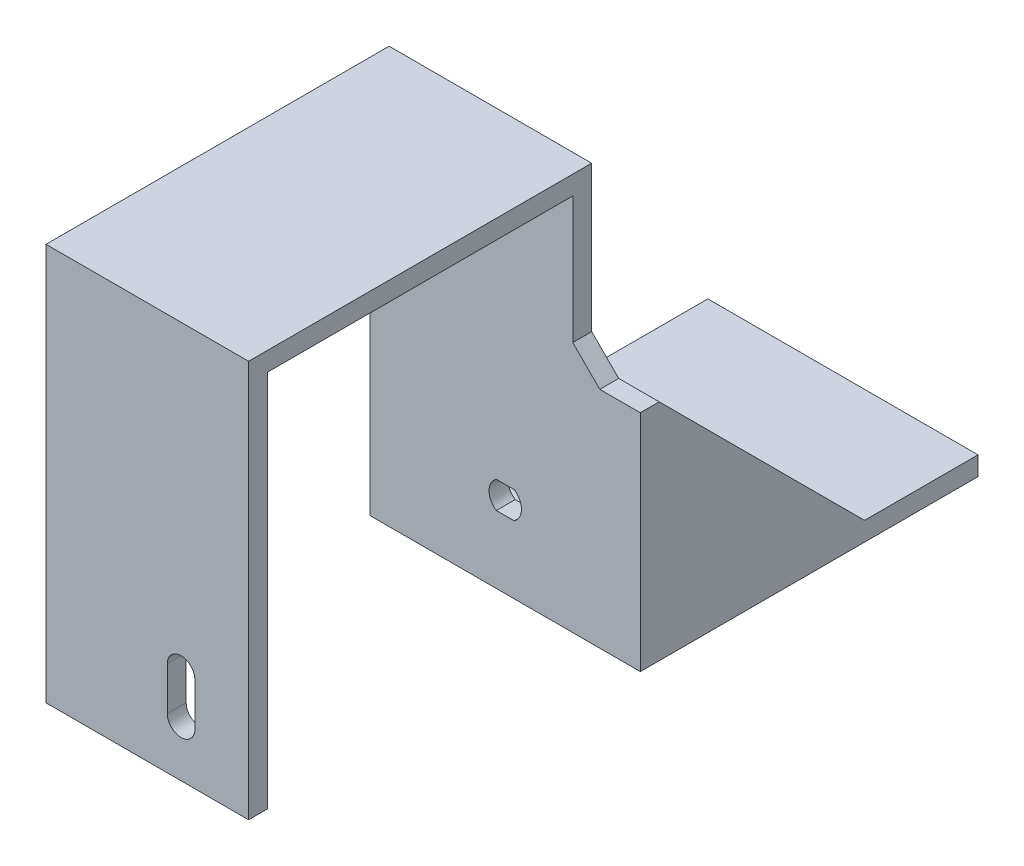
ISO-10303-21;
HEADER;
FILE_DESCRIPTION(('STEP AP214'),'2;1');
FILE_NAME('part.step','',(''),(''),'','','');
FILE_SCHEMA(('AUTOMOTIVE_DESIGN { 1 0 10303 214 1 1 1 1 }'));
ENDSEC;
DATA;
#1=APPLICATION_CONTEXT('core data for automotive mechanical design processes');
#2=APPLICATION_PROTOCOL_DEFINITION('international standard','automotive_design',2000,#1);
#3=PRODUCT_CONTEXT('',#1,'mechanical');
#4=PRODUCT('Part','Part','',(#3));
#5=PRODUCT_RELATED_PRODUCT_CATEGORY('part','',(#4));
#6=PRODUCT_DEFINITION_FORMATION('','',#4);
#7=PRODUCT_DEFINITION_CONTEXT('part definition',#1,'design');
#8=PRODUCT_DEFINITION('design','',#6,#7);
#9=PRODUCT_DEFINITION_SHAPE('','',#8);
#10=(LENGTH_UNIT() NAMED_UNIT(*) SI_UNIT(.MILLI.,.METRE.));
#11=(NAMED_UNIT(*) PLANE_ANGLE_UNIT() SI_UNIT($,.RADIAN.));
#12=(NAMED_UNIT(*) SI_UNIT($,.STERADIAN.) SOLID_ANGLE_UNIT());
#13=UNCERTAINTY_MEASURE_WITH_UNIT(LENGTH_MEASURE(1.E-05),#10,'distance_accuracy_value','');
#14=(GEOMETRIC_REPRESENTATION_CONTEXT(3) GLOBAL_UNCERTAINTY_ASSIGNED_CONTEXT((#13)) GLOBAL_UNIT_ASSIGNED_CONTEXT((#10,
#11,#12)) REPRESENTATION_CONTEXT('',''));
#15=CARTESIAN_POINT('',(0.,0.,0.));
#16=DIRECTION('',(0.,0.,1.));
#17=DIRECTION('',(1.,0.,0.));
#18=AXIS2_PLACEMENT_3D('',#15,#16,#17);
#19=CARTESIAN_POINT('',(46.3871311939213,7.,125.));
#20=DIRECTION('',(-1.,0.,0.));
#21=DIRECTION('',(0.,0.,1.));
#22=AXIS2_PLACEMENT_3D('',#19,#20,#21);
#23=PLANE('',#22);
#24=DIRECTION('',(0.,0.707106781186548,0.707106781186548));
#25=VECTOR('',#24,1.);
#26=CARTESIAN_POINT('',(46.3871311939213,90.,125.));
#27=LINE('',#26,#25);
#28=CARTESIAN_POINT('',(46.3871311939213,7.,42.));
#29=VERTEX_POINT('',#28);
#30=CARTESIAN_POINT('',(46.3871311939213,83.,118.));
#31=VERTEX_POINT('',#30);
#32=EDGE_CURVE('E266',#29,#31,#27,.T.);
#33=ORIENTED_EDGE('',*,*,#32,.T.);
#34=DIRECTION('',(0.,0.,-1.));
#35=VECTOR('',#34,1.);
#36=CARTESIAN_POINT('',(46.3871311939213,83.,245.));
#37=LINE('',#36,#35);
#38=CARTESIAN_POINT('',(46.3871311939213,83.,125.));
#39=VERTEX_POINT('',#38);
#40=EDGE_CURVE('E508',#39,#31,#37,.T.);
#41=ORIENTED_EDGE('',*,*,#40,.F.);
#42=DIRECTION('',(0.,1.,0.));
#43=VECTOR('',#42,1.);
#44=CARTESIAN_POINT('',(46.3871311939213,7.,125.));
#45=LINE('',#44,#43);
#46=CARTESIAN_POINT('',(46.3871311939213,0.,125.));
#47=VERTEX_POINT('',#46);
#48=EDGE_CURVE('E357',#47,#39,#45,.T.);
#49=ORIENTED_EDGE('',*,*,#48,.F.);
#50=DIRECTION('',(0.,0.,-1.));
#51=VECTOR('',#50,1.);
#52=CARTESIAN_POINT('',(46.3871311939213,0.,125.));
#53=LINE('',#52,#51);
#54=CARTESIAN_POINT('',(46.3871311939213,0.,0.));
#55=VERTEX_POINT('',#54);
#56=EDGE_CURVE('E381',#47,#55,#53,.T.);
#57=ORIENTED_EDGE('',*,*,#56,.T.);
#58=DIRECTION('',(0.,1.,0.));
#59=VECTOR('',#58,1.);
#60=CARTESIAN_POINT('',(46.3871311939213,7.,0.));
#61=LINE('',#60,#59);
#62=CARTESIAN_POINT('',(46.3871311939213,7.,0.));
#63=VERTEX_POINT('',#62);
#64=EDGE_CURVE('E369',#55,#63,#61,.T.);
#65=ORIENTED_EDGE('',*,*,#64,.T.);
#66=DIRECTION('',(0.,0.,-1.));
#67=VECTOR('',#66,1.);
#68=CARTESIAN_POINT('',(46.3871311939213,7.,125.));
#69=LINE('',#68,#67);
#70=EDGE_CURVE('E378',#29,#63,#69,.T.);
#71=ORIENTED_EDGE('',*,*,#70,.F.);
#72=EDGE_LOOP('',(#33,#41,#49,#57,#65,#71));
#73=FACE_BOUND('',#72,.T.);
#74=ADVANCED_FACE('F43',(#73),#23,.F.);
#75=CARTESIAN_POINT('',(-53.6128688060787,140.,245.));
#76=DIRECTION('',(0.,1.,0.));
#77=DIRECTION('',(0.,0.,1.));
#78=AXIS2_PLACEMENT_3D('',#75,#76,#77);
#79=PLANE('',#78);
#80=DIRECTION('',(1.,0.,0.));
#81=VECTOR('',#80,1.);
#82=CARTESIAN_POINT('',(-53.6128688060787,140.,125.));
#83=LINE('',#82,#81);
#84=CARTESIAN_POINT('',(-53.6128688060787,140.,125.));
#85=VERTEX_POINT('',#84);
#86=CARTESIAN_POINT('',(21.3871311939213,140.,125.));
#87=VERTEX_POINT('',#86);
#88=EDGE_CURVE('E252',#85,#87,#83,.T.);
#89=ORIENTED_EDGE('',*,*,#88,.T.);
#90=DIRECTION('',(0.,0.,1.));
#91=VECTOR('',#90,1.);
#92=CARTESIAN_POINT('',(21.3871311939213,140.,245.));
#93=LINE('',#92,#91);
#94=CARTESIAN_POINT('',(21.3871311939213,140.,238.));
#95=VERTEX_POINT('',#94);
#96=EDGE_CURVE('E481',#87,#95,#93,.T.);
#97=ORIENTED_EDGE('',*,*,#96,.T.);
#98=DIRECTION('',(1.,0.,0.));
#99=VECTOR('',#98,1.);
#100=CARTESIAN_POINT('',(-53.6128688060787,140.,238.));
#101=LINE('',#100,#99);
#102=CARTESIAN_POINT('',(-53.6128688060787,140.,238.));
#103=VERTEX_POINT('',#102);
#104=EDGE_CURVE('E214',#103,#95,#101,.T.);
#105=ORIENTED_EDGE('',*,*,#104,.F.);
#106=DIRECTION('',(0.,0.,-1.));
#107=VECTOR('',#106,1.);
#108=CARTESIAN_POINT('',(-53.6128688060787,140.,245.));
#109=LINE('',#108,#107);
#110=EDGE_CURVE('E260',#103,#85,#109,.T.);
#111=ORIENTED_EDGE('',*,*,#110,.T.);
#112=EDGE_LOOP('',(#89,#97,#105,#111));
#113=FACE_BOUND('',#112,.T.);
#114=ADVANCED_FACE('F439',(#113),#79,.F.);
#115=CARTESIAN_POINT('',(0.,0.,125.));
#116=DIRECTION('',(0.,0.,-1.));
#117=DIRECTION('',(-1.,0.,0.));
#118=AXIS2_PLACEMENT_3D('',#115,#116,#117);
#119=PLANE('',#118);
#120=CARTESIAN_POINT('',(-3.61286880607874,30.,125.));
#121=DIRECTION('',(0.,0.,1.));
#122=DIRECTION('',(1.,0.,0.));
#123=AXIS2_PLACEMENT_3D('',#120,#121,#122);
#124=CIRCLE('',#123,6.00000000000001);
#125=CARTESIAN_POINT('',(-6.92949359643414,35.,125.));
#126=VERTEX_POINT('',#125);
#127=CARTESIAN_POINT('',(-6.92949359643414,25.,125.));
#128=VERTEX_POINT('',#127);
#129=EDGE_CURVE('E309',#126,#128,#124,.T.);
#130=ORIENTED_EDGE('',*,*,#129,.F.);
#131=DIRECTION('',(-1.,0.,0.));
#132=VECTOR('',#131,1.);
#133=CARTESIAN_POINT('',(0.,35.,125.));
#134=LINE('',#133,#132);
#135=CARTESIAN_POINT('',(-0.296244015723339,35.,125.));
#136=VERTEX_POINT('',#135);
#137=EDGE_CURVE('E306',#136,#126,#134,.T.);
#138=ORIENTED_EDGE('',*,*,#137,.F.);
#139=CARTESIAN_POINT('',(-0.296244015723338,25.,125.));
#140=VERTEX_POINT('',#139);
#141=EDGE_CURVE('E314',#140,#136,#124,.T.);
#142=ORIENTED_EDGE('',*,*,#141,.F.);
#143=DIRECTION('',(1.,0.,0.));
#144=VECTOR('',#143,1.);
#145=CARTESIAN_POINT('',(0.,25.,125.));
#146=LINE('',#145,#144);
#147=EDGE_CURVE('E313',#128,#140,#146,.T.);
#148=ORIENTED_EDGE('',*,*,#147,.F.);
#149=EDGE_LOOP('',(#130,#138,#142,#148));
#150=FACE_BOUND('',#149,.T.);
#151=DIRECTION('',(-1.,0.,0.));
#152=VECTOR('',#151,1.);
#153=CARTESIAN_POINT('',(0.,83.,125.));
#154=LINE('',#153,#152);
#155=CARTESIAN_POINT('',(31.3871311939213,83.,125.));
#156=VERTEX_POINT('',#155);
#157=EDGE_CURVE('E513',#39,#156,#154,.T.);
#158=ORIENTED_EDGE('',*,*,#157,.T.);
#159=DIRECTION('',(0.707106781186544,-0.707106781186551,0.));
#160=VECTOR('',#159,1.);
#161=CARTESIAN_POINT('',(57.1935655969608,57.1935655969602,125.));
#162=LINE('',#161,#160);
#163=CARTESIAN_POINT('',(21.3871311939213,93.0000000000001,125.));
#164=VERTEX_POINT('',#163);
#165=EDGE_CURVE('E11',#156,#164,#162,.F.);
#166=ORIENTED_EDGE('',*,*,#165,.T.);
#167=DIRECTION('',(0.,1.,0.));
#168=VECTOR('',#167,1.);
#169=CARTESIAN_POINT('',(21.3871311939213,0.,125.));
#170=LINE('',#169,#168);
#171=EDGE_CURVE('E480',#164,#87,#170,.T.);
#172=ORIENTED_EDGE('',*,*,#171,.T.);
#173=ORIENTED_EDGE('',*,*,#88,.F.);
#174=DIRECTION('',(0.,-1.,0.));
#175=VECTOR('',#174,1.);
#176=CARTESIAN_POINT('',(-53.6128688060787,7.,125.));
#177=LINE('',#176,#175);
#178=CARTESIAN_POINT('',(-53.6128688060787,0.,125.));
#179=VERTEX_POINT('',#178);
#180=EDGE_CURVE('E350',#85,#179,#177,.T.);
#181=ORIENTED_EDGE('',*,*,#180,.T.);
#182=DIRECTION('',(1.,0.,0.));
#183=VECTOR('',#182,1.);
#184=CARTESIAN_POINT('',(46.3871311939213,0.,125.));
#185=LINE('',#184,#183);
#186=EDGE_CURVE('E353',#179,#47,#185,.T.);
#187=ORIENTED_EDGE('',*,*,#186,.T.);
#188=ORIENTED_EDGE('',*,*,#48,.T.);
#189=EDGE_LOOP('',(#158,#166,#172,#173,#181,#187,#188));
#190=FACE_BOUND('',#189,.T.);
#191=ADVANCED_FACE('F414',(#150,#190),#119,.F.);
#192=CARTESIAN_POINT('',(46.3871311939213,7.,125.));
#193=DIRECTION('',(0.,-1.,0.));
#194=DIRECTION('',(1.,0.,0.));
#195=AXIS2_PLACEMENT_3D('',#192,#193,#194);
#196=PLANE('',#195);
#197=DIRECTION('',(0.,0.,-1.));
#198=VECTOR('',#197,1.);
#199=CARTESIAN_POINT('',(39.3871311939213,7.,125.));
#200=LINE('',#199,#198);
#201=CARTESIAN_POINT('',(39.3871311939213,7.,118.));
#202=VERTEX_POINT('',#201);
#203=CARTESIAN_POINT('',(39.3871311939213,7.,42.));
#204=VERTEX_POINT('',#203);
#205=EDGE_CURVE('E271',#202,#204,#200,.T.);
#206=ORIENTED_EDGE('',*,*,#205,.T.);
#207=DIRECTION('',(1.,0.,0.));
#208=VECTOR('',#207,1.);
#209=CARTESIAN_POINT('',(46.3871311939213,7.,42.));
#210=LINE('',#209,#208);
#211=EDGE_CURVE('E277',#204,#29,#210,.T.);
#212=ORIENTED_EDGE('',*,*,#211,.T.);
#213=ORIENTED_EDGE('',*,*,#70,.T.);
#214=DIRECTION('',(-1.,0.,0.));
#215=VECTOR('',#214,1.);
#216=CARTESIAN_POINT('',(46.3871311939213,7.,0.));
#217=LINE('',#216,#215);
#218=CARTESIAN_POINT('',(-53.6128688060787,7.,0.));
#219=VERTEX_POINT('',#218);
#220=EDGE_CURVE('E354',#63,#219,#217,.T.);
#221=ORIENTED_EDGE('',*,*,#220,.T.);
#222=DIRECTION('',(0.,0.,-1.));
#223=VECTOR('',#222,1.);
#224=CARTESIAN_POINT('',(-53.6128688060787,7.,125.));
#225=LINE('',#224,#223);
#226=CARTESIAN_POINT('',(-53.6128688060787,6.99999999999999,42.));
#227=VERTEX_POINT('',#226);
#228=EDGE_CURVE('E361',#227,#219,#225,.T.);
#229=ORIENTED_EDGE('',*,*,#228,.F.);
#230=DIRECTION('',(1.,0.,0.));
#231=VECTOR('',#230,1.);
#232=CARTESIAN_POINT('',(46.3871311939213,7.,42.));
#233=LINE('',#232,#231);
#234=CARTESIAN_POINT('',(-46.6128688060787,7.,42.));
#235=VERTEX_POINT('',#234);
#236=EDGE_CURVE('E291',#227,#235,#233,.T.);
#237=ORIENTED_EDGE('',*,*,#236,.T.);
#238=DIRECTION('',(0.,0.,-1.));
#239=VECTOR('',#238,1.);
#240=CARTESIAN_POINT('',(-46.6128688060787,7.,125.));
#241=LINE('',#240,#239);
#242=CARTESIAN_POINT('',(-46.6128688060787,7.00000000000001,118.));
#243=VERTEX_POINT('',#242);
#244=EDGE_CURVE('E285',#243,#235,#241,.T.);
#245=ORIENTED_EDGE('',*,*,#244,.F.);
#246=DIRECTION('',(-1.,0.,0.));
#247=VECTOR('',#246,1.);
#248=CARTESIAN_POINT('',(46.3871311939213,7.,118.));
#249=LINE('',#248,#247);
#250=EDGE_CURVE('E335',#202,#243,#249,.T.);
#251=ORIENTED_EDGE('',*,*,#250,.F.);
#252=EDGE_LOOP('',(#206,#212,#213,#221,#229,#237,#245,#251));
#253=FACE_BOUND('',#252,.T.);
#254=ADVANCED_FACE('F449',(#253),#196,.F.);
#255=CARTESIAN_POINT('',(-53.6128688060787,7.,125.));
#256=DIRECTION('',(1.,0.,0.));
#257=DIRECTION('',(0.,0.,-1.));
#258=AXIS2_PLACEMENT_3D('',#255,#256,#257);
#259=PLANE('',#258);
#260=DIRECTION('',(0.,-0.707106781186548,-0.707106781186548));
#261=VECTOR('',#260,1.);
#262=CARTESIAN_POINT('',(-53.6128688060787,90.,125.));
#263=LINE('',#262,#261);
#264=CARTESIAN_POINT('',(-53.6128688060787,83.,118.));
#265=VERTEX_POINT('',#264);
#266=EDGE_CURVE('E280',#265,#227,#263,.T.);
#267=ORIENTED_EDGE('',*,*,#266,.T.);
#268=ORIENTED_EDGE('',*,*,#228,.T.);
#269=DIRECTION('',(0.,-1.,0.));
#270=VECTOR('',#269,1.);
#271=CARTESIAN_POINT('',(-53.6128688060787,7.,0.));
#272=LINE('',#271,#270);
#273=CARTESIAN_POINT('',(-53.6128688060787,0.,0.));
#274=VERTEX_POINT('',#273);
#275=EDGE_CURVE('E349',#219,#274,#272,.T.);
#276=ORIENTED_EDGE('',*,*,#275,.T.);
#277=DIRECTION('',(0.,0.,-1.));
#278=VECTOR('',#277,1.);
#279=CARTESIAN_POINT('',(-53.6128688060787,0.,125.));
#280=LINE('',#279,#278);
#281=EDGE_CURVE('E384',#179,#274,#280,.T.);
#282=ORIENTED_EDGE('',*,*,#281,.F.);
#283=ORIENTED_EDGE('',*,*,#180,.F.);
#284=ORIENTED_EDGE('',*,*,#110,.F.);
#285=DIRECTION('',(0.,1.,0.));
#286=VECTOR('',#285,1.);
#287=CARTESIAN_POINT('',(-53.6128688060787,0.,238.));
#288=LINE('',#287,#286);
#289=CARTESIAN_POINT('',(-53.6128688060787,0.,238.));
#290=VERTEX_POINT('',#289);
#291=EDGE_CURVE('E242',#290,#103,#288,.T.);
#292=ORIENTED_EDGE('',*,*,#291,.F.);
#293=DIRECTION('',(0.,0.,-1.));
#294=VECTOR('',#293,1.);
#295=CARTESIAN_POINT('',(-53.6128688060787,0.,245.));
#296=LINE('',#295,#294);
#297=CARTESIAN_POINT('',(-53.6128688060787,0.,245.));
#298=VERTEX_POINT('',#297);
#299=EDGE_CURVE('E235',#298,#290,#296,.T.);
#300=ORIENTED_EDGE('',*,*,#299,.F.);
#301=DIRECTION('',(0.,-1.,0.));
#302=VECTOR('',#301,1.);
#303=CARTESIAN_POINT('',(-53.6128688060787,147.,245.));
#304=LINE('',#303,#302);
#305=CARTESIAN_POINT('',(-53.6128688060787,147.,245.));
#306=VERTEX_POINT('',#305);
#307=EDGE_CURVE('E253',#306,#298,#304,.T.);
#308=ORIENTED_EDGE('',*,*,#307,.F.);
#309=DIRECTION('',(0.,0.,1.));
#310=VECTOR('',#309,1.);
#311=CARTESIAN_POINT('',(-53.6128688060787,147.,125.));
#312=LINE('',#311,#310);
#313=CARTESIAN_POINT('',(-53.6128688060787,147.,118.));
#314=VERTEX_POINT('',#313);
#315=EDGE_CURVE('E339',#314,#306,#312,.T.);
#316=ORIENTED_EDGE('',*,*,#315,.F.);
#317=DIRECTION('',(0.,-1.,0.));
#318=VECTOR('',#317,1.);
#319=CARTESIAN_POINT('',(-53.6128688060787,147.,118.));
#320=LINE('',#319,#318);
#321=EDGE_CURVE('E343',#314,#265,#320,.T.);
#322=ORIENTED_EDGE('',*,*,#321,.T.);
#323=EDGE_LOOP('',(#267,#268,#276,#282,#283,#284,#292,#300,#308,#316,#322));
#324=FACE_BOUND('',#323,.T.);
#325=ADVANCED_FACE('F454',(#324),#259,.F.);
#326=CARTESIAN_POINT('',(46.3871311939213,0.,125.));
#327=DIRECTION('',(0.,1.,0.));
#328=DIRECTION('',(-1.,0.,0.));
#329=AXIS2_PLACEMENT_3D('',#326,#327,#328);
#330=PLANE('',#329);
#331=DIRECTION('',(1.,0.,0.));
#332=VECTOR('',#331,1.);
#333=CARTESIAN_POINT('',(46.3871311939213,0.,0.));
#334=LINE('',#333,#332);
#335=EDGE_CURVE('E365',#274,#55,#334,.T.);
#336=ORIENTED_EDGE('',*,*,#335,.T.);
#337=ORIENTED_EDGE('',*,*,#56,.F.);
#338=ORIENTED_EDGE('',*,*,#186,.F.);
#339=ORIENTED_EDGE('',*,*,#281,.T.);
#340=EDGE_LOOP('',(#336,#337,#338,#339));
#341=FACE_BOUND('',#340,.T.);
#342=ADVANCED_FACE('F451',(#341),#330,.F.);
#343=CARTESIAN_POINT('',(0.,0.,0.));
#344=DIRECTION('',(0.,0.,-1.));
#345=DIRECTION('',(-1.,0.,0.));
#346=AXIS2_PLACEMENT_3D('',#343,#344,#345);
#347=PLANE('',#346);
#348=ORIENTED_EDGE('',*,*,#275,.F.);
#349=ORIENTED_EDGE('',*,*,#220,.F.);
#350=ORIENTED_EDGE('',*,*,#64,.F.);
#351=ORIENTED_EDGE('',*,*,#335,.F.);
#352=EDGE_LOOP('',(#348,#349,#350,#351));
#353=FACE_BOUND('',#352,.T.);
#354=ADVANCED_FACE('F453',(#353),#347,.T.);
#355=CARTESIAN_POINT('',(46.3871311939213,147.,118.));
#356=DIRECTION('',(0.,0.,1.));
#357=DIRECTION('',(1.,0.,0.));
#358=AXIS2_PLACEMENT_3D('',#355,#356,#357);
#359=PLANE('',#358);
#360=CARTESIAN_POINT('',(-3.61286880607874,30.,118.));
#361=DIRECTION('',(0.,0.,1.));
#362=DIRECTION('',(1.,0.,0.));
#363=AXIS2_PLACEMENT_3D('',#360,#361,#362);
#364=CIRCLE('',#363,6.00000000000001);
#365=CARTESIAN_POINT('',(-0.296244015723339,35.,118.));
#366=VERTEX_POINT('',#365);
#367=CARTESIAN_POINT('',(-0.296244015723338,25.,118.));
#368=VERTEX_POINT('',#367);
#369=EDGE_CURVE('E298',#366,#368,#364,.F.);
#370=ORIENTED_EDGE('',*,*,#369,.F.);
#371=DIRECTION('',(1.,0.,0.));
#372=VECTOR('',#371,1.);
#373=CARTESIAN_POINT('',(0.,35.,118.));
#374=LINE('',#373,#372);
#375=CARTESIAN_POINT('',(-6.92949359643414,35.,118.));
#376=VERTEX_POINT('',#375);
#377=EDGE_CURVE('E302',#376,#366,#374,.T.);
#378=ORIENTED_EDGE('',*,*,#377,.F.);
#379=CARTESIAN_POINT('',(-3.61286880607874,30.,118.));
#380=DIRECTION('',(0.,0.,1.));
#381=DIRECTION('',(1.,0.,0.));
#382=AXIS2_PLACEMENT_3D('',#379,#380,#381);
#383=CIRCLE('',#382,6.00000000000001);
#384=CARTESIAN_POINT('',(-6.92949359643415,25.,118.));
#385=VERTEX_POINT('',#384);
#386=EDGE_CURVE('E321',#385,#376,#383,.F.);
#387=ORIENTED_EDGE('',*,*,#386,.F.);
#388=DIRECTION('',(-1.,0.,0.));
#389=VECTOR('',#388,1.);
#390=CARTESIAN_POINT('',(0.,25.,118.));
#391=LINE('',#390,#389);
#392=EDGE_CURVE('E295',#368,#385,#391,.T.);
#393=ORIENTED_EDGE('',*,*,#392,.F.);
#394=EDGE_LOOP('',(#370,#378,#387,#393));
#395=FACE_BOUND('',#394,.T.);
#396=DIRECTION('',(-1.,0.,0.));
#397=VECTOR('',#396,1.);
#398=CARTESIAN_POINT('',(46.3871311939213,147.,118.));
#399=LINE('',#398,#397);
#400=CARTESIAN_POINT('',(21.3871311939213,147.,118.));
#401=VERTEX_POINT('',#400);
#402=EDGE_CURVE('E336',#401,#314,#399,.T.);
#403=ORIENTED_EDGE('',*,*,#402,.F.);
#404=DIRECTION('',(0.,1.,0.));
#405=VECTOR('',#404,1.);
#406=CARTESIAN_POINT('',(21.3871311939213,83.,118.));
#407=LINE('',#406,#405);
#408=CARTESIAN_POINT('',(21.3871311939213,93.0000000000001,118.));
#409=VERTEX_POINT('',#408);
#410=EDGE_CURVE('E515',#409,#401,#407,.T.);
#411=ORIENTED_EDGE('',*,*,#410,.F.);
#412=DIRECTION('',(-0.707106781186544,0.707106781186551,0.));
#413=VECTOR('',#412,1.);
#414=CARTESIAN_POINT('',(6.88713119392116,107.5,118.));
#415=LINE('',#414,#413);
#416=CARTESIAN_POINT('',(31.3871311939213,83.,118.));
#417=VERTEX_POINT('',#416);
#418=EDGE_CURVE('E53',#409,#417,#415,.F.);
#419=ORIENTED_EDGE('',*,*,#418,.T.);
#420=DIRECTION('',(-1.,0.,0.));
#421=VECTOR('',#420,1.);
#422=CARTESIAN_POINT('',(46.3871311939213,83.,118.));
#423=LINE('',#422,#421);
#424=CARTESIAN_POINT('',(39.3871311939213,83.,118.));
#425=VERTEX_POINT('',#424);
#426=EDGE_CURVE('E231',#425,#417,#423,.T.);
#427=ORIENTED_EDGE('',*,*,#426,.F.);
#428=DIRECTION('',(0.,-1.,0.));
#429=VECTOR('',#428,1.);
#430=CARTESIAN_POINT('',(39.3871311939213,147.,118.));
#431=LINE('',#430,#429);
#432=EDGE_CURVE('E395',#425,#202,#431,.T.);
#433=ORIENTED_EDGE('',*,*,#432,.T.);
#434=ORIENTED_EDGE('',*,*,#250,.T.);
#435=DIRECTION('',(0.,-1.,0.));
#436=VECTOR('',#435,1.);
#437=CARTESIAN_POINT('',(-46.6128688060787,147.,118.));
#438=LINE('',#437,#436);
#439=CARTESIAN_POINT('',(-46.6128688060787,83.,118.));
#440=VERTEX_POINT('',#439);
#441=EDGE_CURVE('E387',#440,#243,#438,.T.);
#442=ORIENTED_EDGE('',*,*,#441,.F.);
#443=DIRECTION('',(-1.,0.,0.));
#444=VECTOR('',#443,1.);
#445=CARTESIAN_POINT('',(46.3871311939213,83.,118.));
#446=LINE('',#445,#444);
#447=EDGE_CURVE('E391',#440,#265,#446,.T.);
#448=ORIENTED_EDGE('',*,*,#447,.T.);
#449=ORIENTED_EDGE('',*,*,#321,.F.);
#450=EDGE_LOOP('',(#403,#411,#419,#427,#433,#434,#442,#448,#449));
#451=FACE_BOUND('',#450,.T.);
#452=ADVANCED_FACE('F426',(#395,#451),#359,.F.);
#453=CARTESIAN_POINT('',(0.,147.,0.));
#454=DIRECTION('',(0.,1.,0.));
#455=DIRECTION('',(-1.,0.,0.));
#456=AXIS2_PLACEMENT_3D('',#453,#454,#455);
#457=PLANE('',#456);
#458=DIRECTION('',(0.,0.,-1.));
#459=VECTOR('',#458,1.);
#460=CARTESIAN_POINT('',(21.3871311939213,147.,245.));
#461=LINE('',#460,#459);
#462=CARTESIAN_POINT('',(21.3871311939213,147.,245.));
#463=VERTEX_POINT('',#462);
#464=EDGE_CURVE('E491',#463,#401,#461,.T.);
#465=ORIENTED_EDGE('',*,*,#464,.T.);
#466=ORIENTED_EDGE('',*,*,#402,.T.);
#467=ORIENTED_EDGE('',*,*,#315,.T.);
#468=DIRECTION('',(-1.,0.,0.));
#469=VECTOR('',#468,1.);
#470=CARTESIAN_POINT('',(-53.6128688060787,147.,245.));
#471=LINE('',#470,#469);
#472=EDGE_CURVE('E257',#463,#306,#471,.T.);
#473=ORIENTED_EDGE('',*,*,#472,.F.);
#474=EDGE_LOOP('',(#465,#466,#467,#473));
#475=FACE_BOUND('',#474,.T.);
#476=ADVANCED_FACE('F489',(#475),#457,.T.);
#477=CARTESIAN_POINT('',(0.,35.,-0.001000000000001));
#478=DIRECTION('',(0.,1.,0.));
#479=DIRECTION('',(0.,0.,1.));
#480=AXIS2_PLACEMENT_3D('',#477,#478,#479);
#481=PLANE('',#480);
#482=ORIENTED_EDGE('',*,*,#377,.T.);
#483=DIRECTION('',(0.,0.,1.));
#484=VECTOR('',#483,1.);
#485=CARTESIAN_POINT('',(-0.296244015723339,35.,-0.001000000000001));
#486=LINE('',#485,#484);
#487=EDGE_CURVE('E318',#366,#136,#486,.T.);
#488=ORIENTED_EDGE('',*,*,#487,.T.);
#489=ORIENTED_EDGE('',*,*,#137,.T.);
#490=DIRECTION('',(0.,0.,1.));
#491=VECTOR('',#490,1.);
#492=CARTESIAN_POINT('',(-6.92949359643413,35.,-0.001000000000001));
#493=LINE('',#492,#491);
#494=EDGE_CURVE('E328',#376,#126,#493,.T.);
#495=ORIENTED_EDGE('',*,*,#494,.F.);
#496=EDGE_LOOP('',(#482,#488,#489,#495));
#497=FACE_BOUND('',#496,.T.);
#498=ADVANCED_FACE('F417',(#497),#481,.F.);
#499=CARTESIAN_POINT('',(-3.61286880607874,30.,-0.001000000000001));
#500=DIRECTION('',(0.,0.,1.));
#501=DIRECTION('',(1.,0.,0.));
#502=AXIS2_PLACEMENT_3D('',#499,#500,#501);
#503=CYLINDRICAL_SURFACE('',#502,6.00000000000001);
#504=ORIENTED_EDGE('',*,*,#369,.T.);
#505=DIRECTION('',(0.,0.,1.));
#506=VECTOR('',#505,1.);
#507=CARTESIAN_POINT('',(-0.296244015723338,25.,-0.001000000000001));
#508=LINE('',#507,#506);
#509=EDGE_CURVE('E322',#368,#140,#508,.T.);
#510=ORIENTED_EDGE('',*,*,#509,.T.);
#511=ORIENTED_EDGE('',*,*,#141,.T.);
#512=ORIENTED_EDGE('',*,*,#487,.F.);
#513=EDGE_LOOP('',(#504,#510,#511,#512));
#514=FACE_BOUND('',#513,.T.);
#515=ADVANCED_FACE('F410',(#514),#503,.F.);
#516=CARTESIAN_POINT('',(0.,25.,-0.001000000000001));
#517=DIRECTION('',(0.,-1.,0.));
#518=DIRECTION('',(0.,0.,-1.));
#519=AXIS2_PLACEMENT_3D('',#516,#517,#518);
#520=PLANE('',#519);
#521=ORIENTED_EDGE('',*,*,#392,.T.);
#522=DIRECTION('',(0.,0.,1.));
#523=VECTOR('',#522,1.);
#524=CARTESIAN_POINT('',(-6.92949359643414,25.,-0.001000000000001));
#525=LINE('',#524,#523);
#526=EDGE_CURVE('E325',#385,#128,#525,.T.);
#527=ORIENTED_EDGE('',*,*,#526,.T.);
#528=ORIENTED_EDGE('',*,*,#147,.T.);
#529=ORIENTED_EDGE('',*,*,#509,.F.);
#530=EDGE_LOOP('',(#521,#527,#528,#529));
#531=FACE_BOUND('',#530,.T.);
#532=ADVANCED_FACE('F428',(#531),#520,.F.);
#533=ORIENTED_EDGE('',*,*,#386,.T.);
#534=ORIENTED_EDGE('',*,*,#494,.T.);
#535=ORIENTED_EDGE('',*,*,#129,.T.);
#536=ORIENTED_EDGE('',*,*,#526,.F.);
#537=EDGE_LOOP('',(#533,#534,#535,#536));
#538=FACE_BOUND('',#537,.T.);
#539=ADVANCED_FACE('F419',(#538),#503,.F.);
#540=CARTESIAN_POINT('',(-46.6128688060787,90.,125.));
#541=DIRECTION('',(0.,0.707106781186547,-0.707106781186547));
#542=DIRECTION('',(0.,0.707106781186548,0.707106781186548));
#543=AXIS2_PLACEMENT_3D('',#540,#541,#542);
#544=PLANE('',#543);
#545=ORIENTED_EDGE('',*,*,#236,.F.);
#546=ORIENTED_EDGE('',*,*,#266,.F.);
#547=ORIENTED_EDGE('',*,*,#447,.F.);
#548=DIRECTION('',(0.,-0.707106781186548,-0.707106781186548));
#549=VECTOR('',#548,1.);
#550=CARTESIAN_POINT('',(-46.6128688060787,90.,125.));
#551=LINE('',#550,#549);
#552=EDGE_CURVE('E281',#440,#235,#551,.T.);
#553=ORIENTED_EDGE('',*,*,#552,.T.);
#554=EDGE_LOOP('',(#545,#546,#547,#553));
#555=FACE_BOUND('',#554,.T.);
#556=ADVANCED_FACE('F435',(#555),#544,.T.);
#557=CARTESIAN_POINT('',(-46.6128688060787,0.,0.));
#558=DIRECTION('',(-1.,0.,0.));
#559=DIRECTION('',(0.,0.,1.));
#560=AXIS2_PLACEMENT_3D('',#557,#558,#559);
#561=PLANE('',#560);
#562=ORIENTED_EDGE('',*,*,#441,.T.);
#563=ORIENTED_EDGE('',*,*,#244,.T.);
#564=ORIENTED_EDGE('',*,*,#552,.F.);
#565=EDGE_LOOP('',(#562,#563,#564));
#566=FACE_BOUND('',#565,.T.);
#567=ADVANCED_FACE('F495',(#566),#561,.F.);
#568=CARTESIAN_POINT('',(39.3871311939213,90.,125.));
#569=DIRECTION('',(0.,0.707106781186547,-0.707106781186547));
#570=DIRECTION('',(0.,0.707106781186548,0.707106781186548));
#571=AXIS2_PLACEMENT_3D('',#568,#569,#570);
#572=PLANE('',#571);
#573=ORIENTED_EDGE('',*,*,#211,.F.);
#574=DIRECTION('',(0.,0.707106781186548,0.707106781186548));
#575=VECTOR('',#574,1.);
#576=CARTESIAN_POINT('',(39.3871311939213,90.,125.));
#577=LINE('',#576,#575);
#578=EDGE_CURVE('E267',#204,#425,#577,.T.);
#579=ORIENTED_EDGE('',*,*,#578,.T.);
#580=DIRECTION('',(-1.,0.,0.));
#581=VECTOR('',#580,1.);
#582=CARTESIAN_POINT('',(46.3871311939213,83.,118.));
#583=LINE('',#582,#581);
#584=EDGE_CURVE('E220',#31,#425,#583,.T.);
#585=ORIENTED_EDGE('',*,*,#584,.F.);
#586=ORIENTED_EDGE('',*,*,#32,.F.);
#587=EDGE_LOOP('',(#573,#579,#585,#586));
#588=FACE_BOUND('',#587,.T.);
#589=ADVANCED_FACE('F505',(#588),#572,.T.);
#590=CARTESIAN_POINT('',(39.3871311939213,0.,0.));
#591=DIRECTION('',(-1.,0.,0.));
#592=DIRECTION('',(0.,0.,1.));
#593=AXIS2_PLACEMENT_3D('',#590,#591,#592);
#594=PLANE('',#593);
#595=ORIENTED_EDGE('',*,*,#205,.F.);
#596=ORIENTED_EDGE('',*,*,#432,.F.);
#597=ORIENTED_EDGE('',*,*,#578,.F.);
#598=EDGE_LOOP('',(#595,#596,#597));
#599=FACE_BOUND('',#598,.T.);
#600=ADVANCED_FACE('F502',(#599),#594,.T.);
#601=CARTESIAN_POINT('',(0.,0.,245.));
#602=DIRECTION('',(0.,0.,1.));
#603=DIRECTION('',(1.,0.,0.));
#604=AXIS2_PLACEMENT_3D('',#601,#602,#603);
#605=PLANE('',#604);
#606=DIRECTION('',(-1.,0.,0.));
#607=VECTOR('',#606,1.);
#608=CARTESIAN_POINT('',(-53.6128688060787,0.,245.));
#609=LINE('',#608,#607);
#610=CARTESIAN_POINT('',(21.3871311939213,0.,245.));
#611=VERTEX_POINT('',#610);
#612=EDGE_CURVE('E238',#611,#298,#609,.T.);
#613=ORIENTED_EDGE('',*,*,#612,.F.);
#614=DIRECTION('',(0.,1.,0.));
#615=VECTOR('',#614,1.);
#616=CARTESIAN_POINT('',(21.3871311939213,83.,245.));
#617=LINE('',#616,#615);
#618=EDGE_CURVE('E227',#611,#463,#617,.T.);
#619=ORIENTED_EDGE('',*,*,#618,.T.);
#620=ORIENTED_EDGE('',*,*,#472,.T.);
#621=ORIENTED_EDGE('',*,*,#307,.T.);
#622=EDGE_LOOP('',(#613,#619,#620,#621));
#623=FACE_BOUND('',#622,.T.);
#624=CARTESIAN_POINT('',(-3.61286880607872,35.,245.));
#625=DIRECTION('',(0.,0.,1.));
#626=DIRECTION('',(-1.,0.,0.));
#627=AXIS2_PLACEMENT_3D('',#624,#625,#626);
#628=CIRCLE('',#627,5.10355991505071);
#629=CARTESIAN_POINT('',(1.49069110897199,35.,245.));
#630=VERTEX_POINT('',#629);
#631=CARTESIAN_POINT('',(-8.71642872112944,35.,245.));
#632=VERTEX_POINT('',#631);
#633=EDGE_CURVE('E535',#630,#632,#628,.T.);
#634=ORIENTED_EDGE('',*,*,#633,.F.);
#635=DIRECTION('',(0.,1.,0.));
#636=VECTOR('',#635,1.);
#637=CARTESIAN_POINT('',(1.49069110897199,35.,245.));
#638=LINE('',#637,#636);
#639=CARTESIAN_POINT('',(1.49069110897199,19.,245.));
#640=VERTEX_POINT('',#639);
#641=EDGE_CURVE('E531',#640,#630,#638,.T.);
#642=ORIENTED_EDGE('',*,*,#641,.F.);
#643=CARTESIAN_POINT('',(-3.61286880607872,19.,245.));
#644=DIRECTION('',(0.,0.,1.));
#645=DIRECTION('',(1.,0.,0.));
#646=AXIS2_PLACEMENT_3D('',#643,#644,#645);
#647=CIRCLE('',#646,5.10355991505071);
#648=CARTESIAN_POINT('',(-8.71642872112943,19.,245.));
#649=VERTEX_POINT('',#648);
#650=EDGE_CURVE('E543',#649,#640,#647,.T.);
#651=ORIENTED_EDGE('',*,*,#650,.F.);
#652=DIRECTION('',(0.,-1.,0.));
#653=VECTOR('',#652,1.);
#654=CARTESIAN_POINT('',(-8.71642872112944,35.,245.));
#655=LINE('',#654,#653);
#656=EDGE_CURVE('E547',#632,#649,#655,.T.);
#657=ORIENTED_EDGE('',*,*,#656,.F.);
#658=EDGE_LOOP('',(#634,#642,#651,#657));
#659=FACE_BOUND('',#658,.T.);
#660=ADVANCED_FACE('F484',(#623,#659),#605,.T.);
#661=CARTESIAN_POINT('',(-53.6128688060787,0.,238.));
#662=DIRECTION('',(0.,0.,1.));
#663=DIRECTION('',(1.,0.,0.));
#664=AXIS2_PLACEMENT_3D('',#661,#662,#663);
#665=PLANE('',#664);
#666=DIRECTION('',(0.,-1.,0.));
#667=VECTOR('',#666,1.);
#668=CARTESIAN_POINT('',(1.49069110897199,35.,238.));
#669=LINE('',#668,#667);
#670=CARTESIAN_POINT('',(1.49069110897199,35.,238.));
#671=VERTEX_POINT('',#670);
#672=CARTESIAN_POINT('',(1.49069110897199,19.,238.));
#673=VERTEX_POINT('',#672);
#674=EDGE_CURVE('E556',#671,#673,#669,.T.);
#675=ORIENTED_EDGE('',*,*,#674,.F.);
#676=CARTESIAN_POINT('',(-3.61286880607872,35.,238.));
#677=DIRECTION('',(0.,0.,1.));
#678=DIRECTION('',(1.,0.,0.));
#679=AXIS2_PLACEMENT_3D('',#676,#677,#678);
#680=CIRCLE('',#679,5.10355991505071);
#681=CARTESIAN_POINT('',(-8.71642872112944,35.,238.));
#682=VERTEX_POINT('',#681);
#683=EDGE_CURVE('E530',#682,#671,#680,.F.);
#684=ORIENTED_EDGE('',*,*,#683,.F.);
#685=DIRECTION('',(0.,1.,0.));
#686=VECTOR('',#685,1.);
#687=CARTESIAN_POINT('',(-8.71642872112944,35.,238.));
#688=LINE('',#687,#686);
#689=CARTESIAN_POINT('',(-8.71642872112943,19.,238.));
#690=VERTEX_POINT('',#689);
#691=EDGE_CURVE('E526',#690,#682,#688,.T.);
#692=ORIENTED_EDGE('',*,*,#691,.F.);
#693=CARTESIAN_POINT('',(-3.61286880607872,19.,238.));
#694=DIRECTION('',(0.,0.,1.));
#695=DIRECTION('',(1.,0.,0.));
#696=AXIS2_PLACEMENT_3D('',#693,#694,#695);
#697=CIRCLE('',#696,5.10355991505071);
#698=EDGE_CURVE('E249',#673,#690,#697,.F.);
#699=ORIENTED_EDGE('',*,*,#698,.F.);
#700=EDGE_LOOP('',(#675,#684,#692,#699));
#701=FACE_BOUND('',#700,.T.);
#702=DIRECTION('',(0.,-1.,0.));
#703=VECTOR('',#702,1.);
#704=CARTESIAN_POINT('',(21.3871311939213,0.,238.));
#705=LINE('',#704,#703);
#706=CARTESIAN_POINT('',(21.3871311939213,0.,238.));
#707=VERTEX_POINT('',#706);
#708=EDGE_CURVE('E207',#95,#707,#705,.T.);
#709=ORIENTED_EDGE('',*,*,#708,.T.);
#710=DIRECTION('',(1.,0.,0.));
#711=VECTOR('',#710,1.);
#712=CARTESIAN_POINT('',(-53.6128688060787,0.,238.));
#713=LINE('',#712,#711);
#714=EDGE_CURVE('E211',#290,#707,#713,.T.);
#715=ORIENTED_EDGE('',*,*,#714,.F.);
#716=ORIENTED_EDGE('',*,*,#291,.T.);
#717=ORIENTED_EDGE('',*,*,#104,.T.);
#718=EDGE_LOOP('',(#709,#715,#716,#717));
#719=FACE_BOUND('',#718,.T.);
#720=ADVANCED_FACE('F209',(#701,#719),#665,.F.);
#721=CARTESIAN_POINT('',(0.,0.,0.));
#722=DIRECTION('',(0.,-1.,0.));
#723=DIRECTION('',(0.,0.,-1.));
#724=AXIS2_PLACEMENT_3D('',#721,#722,#723);
#725=PLANE('',#724);
#726=DIRECTION('',(0.,0.,1.));
#727=VECTOR('',#726,1.);
#728=CARTESIAN_POINT('',(21.3871311939213,0.,-0.001000000000001));
#729=LINE('',#728,#727);
#730=EDGE_CURVE('E223',#707,#611,#729,.T.);
#731=ORIENTED_EDGE('',*,*,#730,.T.);
#732=ORIENTED_EDGE('',*,*,#612,.T.);
#733=ORIENTED_EDGE('',*,*,#299,.T.);
#734=ORIENTED_EDGE('',*,*,#714,.T.);
#735=EDGE_LOOP('',(#731,#732,#733,#734));
#736=FACE_BOUND('',#735,.T.);
#737=ADVANCED_FACE('F233',(#736),#725,.T.);
#738=CARTESIAN_POINT('',(-3.61286880607872,35.,-0.001000000000001));
#739=DIRECTION('',(0.,0.,1.));
#740=DIRECTION('',(1.,0.,0.));
#741=AXIS2_PLACEMENT_3D('',#738,#739,#740);
#742=CYLINDRICAL_SURFACE('',#741,5.10355991505071);
#743=ORIENTED_EDGE('',*,*,#683,.T.);
#744=DIRECTION('',(0.,0.,1.));
#745=VECTOR('',#744,1.);
#746=CARTESIAN_POINT('',(1.49069110897199,35.,-0.001000000000001));
#747=LINE('',#746,#745);
#748=EDGE_CURVE('E539',#671,#630,#747,.T.);
#749=ORIENTED_EDGE('',*,*,#748,.T.);
#750=ORIENTED_EDGE('',*,*,#633,.T.);
#751=DIRECTION('',(0.,0.,1.));
#752=VECTOR('',#751,1.);
#753=CARTESIAN_POINT('',(-8.71642872112944,35.,-0.001000000000001));
#754=LINE('',#753,#752);
#755=EDGE_CURVE('E525',#682,#632,#754,.T.);
#756=ORIENTED_EDGE('',*,*,#755,.F.);
#757=EDGE_LOOP('',(#743,#749,#750,#756));
#758=FACE_BOUND('',#757,.T.);
#759=ADVANCED_FACE('F580',(#758),#742,.F.);
#760=CARTESIAN_POINT('',(1.49069110897199,35.,-0.001000000000001));
#761=DIRECTION('',(1.,0.,0.));
#762=DIRECTION('',(0.,1.,0.));
#763=AXIS2_PLACEMENT_3D('',#760,#761,#762);
#764=PLANE('',#763);
#765=ORIENTED_EDGE('',*,*,#674,.T.);
#766=DIRECTION('',(0.,0.,1.));
#767=VECTOR('',#766,1.);
#768=CARTESIAN_POINT('',(1.49069110897199,19.,-0.001000000000001));
#769=LINE('',#768,#767);
#770=EDGE_CURVE('E536',#673,#640,#769,.T.);
#771=ORIENTED_EDGE('',*,*,#770,.T.);
#772=ORIENTED_EDGE('',*,*,#641,.T.);
#773=ORIENTED_EDGE('',*,*,#748,.F.);
#774=EDGE_LOOP('',(#765,#771,#772,#773));
#775=FACE_BOUND('',#774,.T.);
#776=ADVANCED_FACE('F582',(#775),#764,.F.);
#777=CARTESIAN_POINT('',(-3.61286880607872,19.,-0.001000000000001));
#778=DIRECTION('',(0.,0.,1.));
#779=DIRECTION('',(1.,0.,0.));
#780=AXIS2_PLACEMENT_3D('',#777,#778,#779);
#781=CYLINDRICAL_SURFACE('',#780,5.10355991505071);
#782=ORIENTED_EDGE('',*,*,#698,.T.);
#783=DIRECTION('',(0.,0.,1.));
#784=VECTOR('',#783,1.);
#785=CARTESIAN_POINT('',(-8.71642872112943,19.,-0.001000000000001));
#786=LINE('',#785,#784);
#787=EDGE_CURVE('E532',#690,#649,#786,.T.);
#788=ORIENTED_EDGE('',*,*,#787,.T.);
#789=ORIENTED_EDGE('',*,*,#650,.T.);
#790=ORIENTED_EDGE('',*,*,#770,.F.);
#791=EDGE_LOOP('',(#782,#788,#789,#790));
#792=FACE_BOUND('',#791,.T.);
#793=ADVANCED_FACE('F576',(#792),#781,.F.);
#794=CARTESIAN_POINT('',(-8.71642872112944,35.,-0.001000000000001));
#795=DIRECTION('',(-1.,0.,0.));
#796=DIRECTION('',(0.,-1.,0.));
#797=AXIS2_PLACEMENT_3D('',#794,#795,#796);
#798=PLANE('',#797);
#799=ORIENTED_EDGE('',*,*,#691,.T.);
#800=ORIENTED_EDGE('',*,*,#755,.T.);
#801=ORIENTED_EDGE('',*,*,#656,.T.);
#802=ORIENTED_EDGE('',*,*,#787,.F.);
#803=EDGE_LOOP('',(#799,#800,#801,#802));
#804=FACE_BOUND('',#803,.T.);
#805=ADVANCED_FACE('F567',(#804),#798,.F.);
#806=CARTESIAN_POINT('',(21.3871311939213,83.,245.));
#807=DIRECTION('',(-1.,0.,0.));
#808=DIRECTION('',(0.,0.,1.));
#809=AXIS2_PLACEMENT_3D('',#806,#807,#808);
#810=PLANE('',#809);
#811=ORIENTED_EDGE('',*,*,#171,.F.);
#812=DIRECTION('',(0.,0.,-1.));
#813=VECTOR('',#812,1.);
#814=CARTESIAN_POINT('',(21.3871311939213,93.0000000000001,118.));
#815=LINE('',#814,#813);
#816=EDGE_CURVE('E219',#164,#409,#815,.T.);
#817=ORIENTED_EDGE('',*,*,#816,.T.);
#818=ORIENTED_EDGE('',*,*,#410,.T.);
#819=ORIENTED_EDGE('',*,*,#464,.F.);
#820=ORIENTED_EDGE('',*,*,#618,.F.);
#821=ORIENTED_EDGE('',*,*,#730,.F.);
#822=ORIENTED_EDGE('',*,*,#708,.F.);
#823=ORIENTED_EDGE('',*,*,#96,.F.);
#824=EDGE_LOOP('',(#811,#817,#818,#819,#820,#821,#822,#823));
#825=FACE_BOUND('',#824,.T.);
#826=ADVANCED_FACE('F225',(#825),#810,.F.);
#827=CARTESIAN_POINT('',(46.3871311939213,83.,245.));
#828=DIRECTION('',(0.,-1.,0.));
#829=DIRECTION('',(0.,0.,-1.));
#830=AXIS2_PLACEMENT_3D('',#827,#828,#829);
#831=PLANE('',#830);
#832=ORIENTED_EDGE('',*,*,#426,.T.);
#833=DIRECTION('',(0.,0.,1.));
#834=VECTOR('',#833,1.);
#835=CARTESIAN_POINT('',(31.3871311939213,83.,125.));
#836=LINE('',#835,#834);
#837=EDGE_CURVE('E60',#417,#156,#836,.T.);
#838=ORIENTED_EDGE('',*,*,#837,.T.);
#839=ORIENTED_EDGE('',*,*,#157,.F.);
#840=ORIENTED_EDGE('',*,*,#40,.T.);
#841=ORIENTED_EDGE('',*,*,#584,.T.);
#842=EDGE_LOOP('',(#832,#838,#839,#840,#841));
#843=FACE_BOUND('',#842,.T.);
#844=ADVANCED_FACE('F750',(#843),#831,.F.);
#845=CARTESIAN_POINT('',(21.3871311939213,93.0000000000001,245.));
#846=DIRECTION('',(0.707106781186551,0.707106781186543,0.));
#847=DIRECTION('',(0.,0.,1.));
#848=AXIS2_PLACEMENT_3D('',#845,#846,#847);
#849=PLANE('',#848);
#850=ORIENTED_EDGE('',*,*,#165,.F.);
#851=ORIENTED_EDGE('',*,*,#837,.F.);
#852=ORIENTED_EDGE('',*,*,#418,.F.);
#853=ORIENTED_EDGE('',*,*,#816,.F.);
#854=EDGE_LOOP('',(#850,#851,#852,#853));
#855=FACE_BOUND('',#854,.T.);
#856=ADVANCED_FACE('F46',(#855),#849,.T.);
#857=CLOSED_SHELL('',(#74,#114,#191,#254,#325,#342,#354,#452,#476,#498,#515,#532,#539,#556,#567,
#589,#600,#660,#720,#737,#759,#776,#793,#805,#826,#844,#856));
#858=MANIFOLD_SOLID_BREP('B2',#857);
#859=ADVANCED_BREP_SHAPE_REPRESENTATION('',(#18,#858),#14);
#860=SHAPE_DEFINITION_REPRESENTATION(#9,#859);
ENDSEC;
END-ISO-10303-21;
